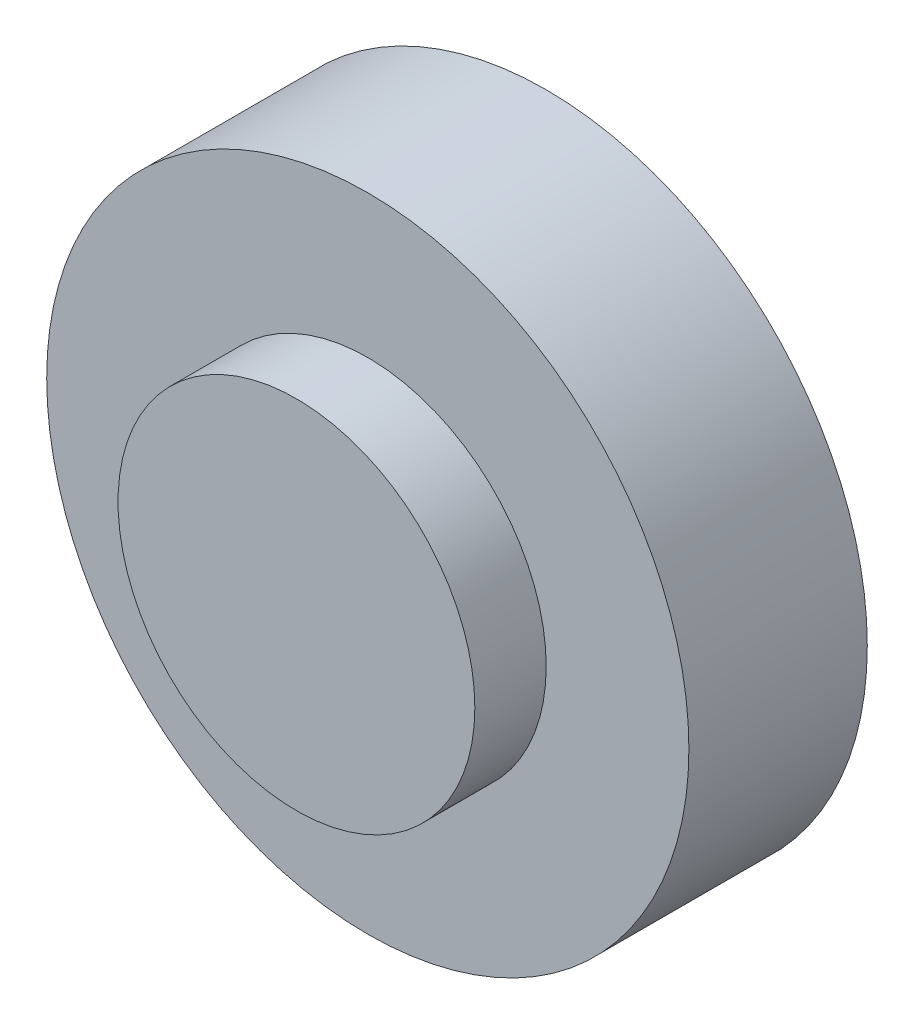
ISO-10303-21;
HEADER;
FILE_DESCRIPTION(('STEP AP214'),'2;1');
FILE_NAME('part.step','',(''),(''),'','','');
FILE_SCHEMA(('AUTOMOTIVE_DESIGN { 1 0 10303 214 1 1 1 1 }'));
ENDSEC;
DATA;
#1=APPLICATION_CONTEXT('core data for automotive mechanical design processes');
#2=APPLICATION_PROTOCOL_DEFINITION('international standard','automotive_design',2000,#1);
#3=PRODUCT_CONTEXT('',#1,'mechanical');
#4=PRODUCT('Part','Part','',(#3));
#5=PRODUCT_RELATED_PRODUCT_CATEGORY('part','',(#4));
#6=PRODUCT_DEFINITION_FORMATION('','',#4);
#7=PRODUCT_DEFINITION_CONTEXT('part definition',#1,'design');
#8=PRODUCT_DEFINITION('design','',#6,#7);
#9=PRODUCT_DEFINITION_SHAPE('','',#8);
#10=(LENGTH_UNIT() NAMED_UNIT(*) SI_UNIT(.MILLI.,.METRE.));
#11=(NAMED_UNIT(*) PLANE_ANGLE_UNIT() SI_UNIT($,.RADIAN.));
#12=(NAMED_UNIT(*) SI_UNIT($,.STERADIAN.) SOLID_ANGLE_UNIT());
#13=UNCERTAINTY_MEASURE_WITH_UNIT(LENGTH_MEASURE(1.E-05),#10,'distance_accuracy_value','');
#14=(GEOMETRIC_REPRESENTATION_CONTEXT(3) GLOBAL_UNCERTAINTY_ASSIGNED_CONTEXT((#13)) GLOBAL_UNIT_ASSIGNED_CONTEXT((#10,
#11,#12)) REPRESENTATION_CONTEXT('',''));
#15=CARTESIAN_POINT('',(0.,0.,0.));
#16=DIRECTION('',(0.,0.,1.));
#17=DIRECTION('',(1.,0.,0.));
#18=AXIS2_PLACEMENT_3D('',#15,#16,#17);
#19=CARTESIAN_POINT('',(0.,0.,35.));
#20=DIRECTION('',(0.,0.,-1.));
#21=DIRECTION('',(-1.,0.,0.));
#22=AXIS2_PLACEMENT_3D('',#19,#20,#21);
#23=CYLINDRICAL_SURFACE('',#22,45.);
#24=CARTESIAN_POINT('',(0.,0.,0.));
#25=DIRECTION('',(0.,0.,1.));
#26=DIRECTION('',(1.,0.,0.));
#27=AXIS2_PLACEMENT_3D('',#24,#25,#26);
#28=CIRCLE('',#27,45.);
#29=CARTESIAN_POINT('',(45.,0.,0.));
#30=VERTEX_POINT('',#29);
#31=EDGE_CURVE('E10',#30,#30,#28,.T.);
#32=ORIENTED_EDGE('',*,*,#31,.T.);
#33=EDGE_LOOP('',(#32));
#34=FACE_BOUND('',#33,.T.);
#35=CARTESIAN_POINT('',(0.,0.,25.));
#36=DIRECTION('',(0.,0.,1.));
#37=DIRECTION('',(1.,0.,0.));
#38=AXIS2_PLACEMENT_3D('',#35,#36,#37);
#39=CIRCLE('',#38,45.);
#40=CARTESIAN_POINT('',(45.,0.,25.));
#41=VERTEX_POINT('',#40);
#42=EDGE_CURVE('E40',#41,#41,#39,.T.);
#43=ORIENTED_EDGE('',*,*,#42,.F.);
#44=EDGE_LOOP('',(#43));
#45=FACE_BOUND('',#44,.T.);
#46=ADVANCED_FACE('F29',(#34,#45),#23,.T.);
#47=CARTESIAN_POINT('',(0.,0.,0.));
#48=DIRECTION('',(0.,0.,1.));
#49=DIRECTION('',(1.,0.,0.));
#50=AXIS2_PLACEMENT_3D('',#47,#48,#49);
#51=PLANE('',#50);
#52=CARTESIAN_POINT('',(0.,0.,0.));
#53=DIRECTION('',(0.,0.,-1.));
#54=DIRECTION('',(-1.,0.,0.));
#55=AXIS2_PLACEMENT_3D('',#52,#53,#54);
#56=CIRCLE('',#55,25.);
#57=CARTESIAN_POINT('',(-25.,0.,0.));
#58=VERTEX_POINT('',#57);
#59=EDGE_CURVE('E51',#58,#58,#56,.T.);
#60=ORIENTED_EDGE('',*,*,#59,.F.);
#61=EDGE_LOOP('',(#60));
#62=FACE_BOUND('',#61,.T.);
#63=ORIENTED_EDGE('',*,*,#31,.F.);
#64=EDGE_LOOP('',(#63));
#65=FACE_BOUND('',#64,.T.);
#66=ADVANCED_FACE('F77',(#62,#65),#51,.F.);
#67=CARTESIAN_POINT('',(0.,0.,25.));
#68=DIRECTION('',(0.,0.,1.));
#69=DIRECTION('',(1.,0.,0.));
#70=AXIS2_PLACEMENT_3D('',#67,#68,#69);
#71=PLANE('',#70);
#72=CARTESIAN_POINT('',(0.,0.,25.));
#73=DIRECTION('',(0.,0.,1.));
#74=DIRECTION('',(1.,0.,0.));
#75=AXIS2_PLACEMENT_3D('',#72,#73,#74);
#76=CIRCLE('',#75,25.);
#77=CARTESIAN_POINT('',(25.,0.,25.));
#78=VERTEX_POINT('',#77);
#79=EDGE_CURVE('E45',#78,#78,#76,.T.);
#80=ORIENTED_EDGE('',*,*,#79,.F.);
#81=EDGE_LOOP('',(#80));
#82=FACE_BOUND('',#81,.T.);
#83=ORIENTED_EDGE('',*,*,#42,.T.);
#84=EDGE_LOOP('',(#83));
#85=FACE_BOUND('',#84,.T.);
#86=ADVANCED_FACE('F81',(#82,#85),#71,.T.);
#87=CARTESIAN_POINT('',(0.,0.,25.));
#88=DIRECTION('',(0.,0.,1.));
#89=DIRECTION('',(1.,0.,0.));
#90=AXIS2_PLACEMENT_3D('',#87,#88,#89);
#91=CYLINDRICAL_SURFACE('',#90,25.);
#92=ORIENTED_EDGE('',*,*,#79,.T.);
#93=EDGE_LOOP('',(#92));
#94=FACE_BOUND('',#93,.T.);
#95=CARTESIAN_POINT('',(0.,0.,35.));
#96=DIRECTION('',(0.,0.,1.));
#97=DIRECTION('',(1.,0.,0.));
#98=AXIS2_PLACEMENT_3D('',#95,#96,#97);
#99=CIRCLE('',#98,25.);
#100=CARTESIAN_POINT('',(25.,0.,35.));
#101=VERTEX_POINT('',#100);
#102=EDGE_CURVE('E46',#101,#101,#99,.T.);
#103=ORIENTED_EDGE('',*,*,#102,.F.);
#104=EDGE_LOOP('',(#103));
#105=FACE_BOUND('',#104,.T.);
#106=ADVANCED_FACE('F87',(#94,#105),#91,.T.);
#107=CARTESIAN_POINT('',(0.,0.,35.));
#108=DIRECTION('',(0.,0.,1.));
#109=DIRECTION('',(1.,0.,0.));
#110=AXIS2_PLACEMENT_3D('',#107,#108,#109);
#111=PLANE('',#110);
#112=ORIENTED_EDGE('',*,*,#102,.T.);
#113=EDGE_LOOP('',(#112));
#114=FACE_BOUND('',#113,.T.);
#115=ADVANCED_FACE('F93',(#114),#111,.T.);
#116=CARTESIAN_POINT('',(0.,0.,20.));
#117=DIRECTION('',(0.,0.,-1.));
#118=DIRECTION('',(-1.,0.,0.));
#119=AXIS2_PLACEMENT_3D('',#116,#117,#118);
#120=PLANE('',#119);
#121=CARTESIAN_POINT('',(0.,0.,20.));
#122=DIRECTION('',(0.,0.,-1.));
#123=DIRECTION('',(-1.,0.,0.));
#124=AXIS2_PLACEMENT_3D('',#121,#122,#123);
#125=CIRCLE('',#124,25.);
#126=CARTESIAN_POINT('',(-25.,0.,20.));
#127=VERTEX_POINT('',#126);
#128=EDGE_CURVE('E54',#127,#127,#125,.T.);
#129=ORIENTED_EDGE('',*,*,#128,.T.);
#130=EDGE_LOOP('',(#129));
#131=FACE_BOUND('',#130,.T.);
#132=CARTESIAN_POINT('',(0.,0.,20.));
#133=DIRECTION('',(0.,0.,-1.));
#134=DIRECTION('',(-1.,0.,0.));
#135=AXIS2_PLACEMENT_3D('',#132,#133,#134);
#136=CIRCLE('',#135,12.5);
#137=CARTESIAN_POINT('',(-12.5,0.,20.));
#138=VERTEX_POINT('',#137);
#139=EDGE_CURVE('E32',#138,#138,#136,.F.);
#140=ORIENTED_EDGE('',*,*,#139,.T.);
#141=EDGE_LOOP('',(#140));
#142=FACE_BOUND('',#141,.T.);
#143=ADVANCED_FACE('F61',(#131,#142),#120,.T.);
#144=CARTESIAN_POINT('',(0.,0.,20.));
#145=DIRECTION('',(0.,0.,-1.));
#146=DIRECTION('',(-1.,0.,0.));
#147=AXIS2_PLACEMENT_3D('',#144,#145,#146);
#148=CYLINDRICAL_SURFACE('',#147,25.);
#149=ORIENTED_EDGE('',*,*,#128,.F.);
#150=EDGE_LOOP('',(#149));
#151=FACE_BOUND('',#150,.T.);
#152=ORIENTED_EDGE('',*,*,#59,.T.);
#153=EDGE_LOOP('',(#152));
#154=FACE_BOUND('',#153,.T.);
#155=ADVANCED_FACE('F71',(#151,#154),#148,.F.);
#156=CARTESIAN_POINT('',(0.,0.,25.));
#157=DIRECTION('',(0.,0.,-1.));
#158=DIRECTION('',(-1.,0.,0.));
#159=AXIS2_PLACEMENT_3D('',#156,#157,#158);
#160=PLANE('',#159);
#161=CARTESIAN_POINT('',(0.,0.,25.));
#162=DIRECTION('',(0.,0.,-1.));
#163=DIRECTION('',(-1.,0.,0.));
#164=AXIS2_PLACEMENT_3D('',#161,#162,#163);
#165=CIRCLE('',#164,12.5);
#166=CARTESIAN_POINT('',(-12.5,0.,25.));
#167=VERTEX_POINT('',#166);
#168=EDGE_CURVE('E36',#167,#167,#165,.T.);
#169=ORIENTED_EDGE('',*,*,#168,.T.);
#170=EDGE_LOOP('',(#169));
#171=FACE_BOUND('',#170,.T.);
#172=ADVANCED_FACE('F65',(#171),#160,.T.);
#173=CARTESIAN_POINT('',(0.,0.,25.));
#174=DIRECTION('',(0.,0.,-1.));
#175=DIRECTION('',(-1.,0.,0.));
#176=AXIS2_PLACEMENT_3D('',#173,#174,#175);
#177=CYLINDRICAL_SURFACE('',#176,12.5);
#178=ORIENTED_EDGE('',*,*,#168,.F.);
#179=EDGE_LOOP('',(#178));
#180=FACE_BOUND('',#179,.T.);
#181=ORIENTED_EDGE('',*,*,#139,.F.);
#182=EDGE_LOOP('',(#181));
#183=FACE_BOUND('',#182,.T.);
#184=ADVANCED_FACE('F63',(#180,#183),#177,.F.);
#185=CLOSED_SHELL('',(#46,#66,#86,#106,#115,#143,#155,#172,#184));
#186=MANIFOLD_SOLID_BREP('B2',#185);
#187=ADVANCED_BREP_SHAPE_REPRESENTATION('',(#18,#186),#14);
#188=SHAPE_DEFINITION_REPRESENTATION(#9,#187);
ENDSEC;
END-ISO-10303-21;
